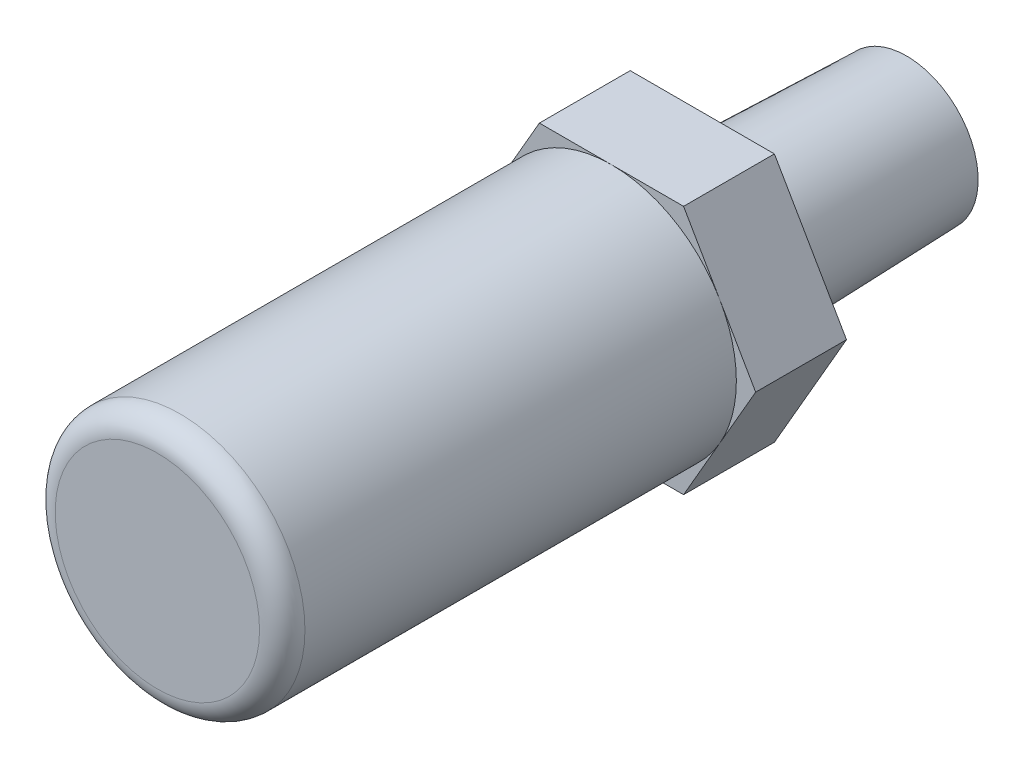
ISO-10303-21;
HEADER;
FILE_DESCRIPTION(('STEP AP214'),'2;1');
FILE_NAME('part.step','',(''),(''),'','','');
FILE_SCHEMA(('AUTOMOTIVE_DESIGN { 1 0 10303 214 1 1 1 1 }'));
ENDSEC;
DATA;
#1=APPLICATION_CONTEXT('core data for automotive mechanical design processes');
#2=APPLICATION_PROTOCOL_DEFINITION('international standard','automotive_design',2000,#1);
#3=PRODUCT_CONTEXT('',#1,'mechanical');
#4=PRODUCT('Part','Part','',(#3));
#5=PRODUCT_RELATED_PRODUCT_CATEGORY('part','',(#4));
#6=PRODUCT_DEFINITION_FORMATION('','',#4);
#7=PRODUCT_DEFINITION_CONTEXT('part definition',#1,'design');
#8=PRODUCT_DEFINITION('design','',#6,#7);
#9=PRODUCT_DEFINITION_SHAPE('','',#8);
#10=(LENGTH_UNIT() NAMED_UNIT(*) SI_UNIT(.MILLI.,.METRE.));
#11=(NAMED_UNIT(*) PLANE_ANGLE_UNIT() SI_UNIT($,.RADIAN.));
#12=(NAMED_UNIT(*) SI_UNIT($,.STERADIAN.) SOLID_ANGLE_UNIT());
#13=UNCERTAINTY_MEASURE_WITH_UNIT(LENGTH_MEASURE(1.E-05),#10,'distance_accuracy_value','');
#14=(GEOMETRIC_REPRESENTATION_CONTEXT(3) GLOBAL_UNCERTAINTY_ASSIGNED_CONTEXT((#13)) GLOBAL_UNIT_ASSIGNED_CONTEXT((#10,
#11,#12)) REPRESENTATION_CONTEXT('',''));
#15=CARTESIAN_POINT('',(0.,0.,0.));
#16=DIRECTION('',(0.,0.,1.));
#17=DIRECTION('',(1.,0.,0.));
#18=AXIS2_PLACEMENT_3D('',#15,#16,#17);
#19=CARTESIAN_POINT('',(0.,0.,-40.));
#20=DIRECTION('',(0.,0.,1.));
#21=DIRECTION('',(1.,0.,0.));
#22=AXIS2_PLACEMENT_3D('',#19,#20,#21);
#23=CYLINDRICAL_SURFACE('',#22,11.);
#24=CARTESIAN_POINT('',(0.,0.,-2.));
#25=DIRECTION('',(0.,0.,1.));
#26=DIRECTION('',(1.,0.,0.));
#27=AXIS2_PLACEMENT_3D('',#24,#25,#26);
#28=CIRCLE('',#27,11.);
#29=CARTESIAN_POINT('',(11.,0.,-2.));
#30=VERTEX_POINT('',#29);
#31=EDGE_CURVE('E11',#30,#30,#28,.F.);
#32=ORIENTED_EDGE('',*,*,#31,.T.);
#33=EDGE_LOOP('',(#32));
#34=FACE_BOUND('',#33,.T.);
#35=CARTESIAN_POINT('',(0.,0.,-40.));
#36=DIRECTION('',(0.,0.,1.));
#37=DIRECTION('',(1.,0.,0.));
#38=AXIS2_PLACEMENT_3D('',#35,#36,#37);
#39=CIRCLE('',#38,11.);
#40=CARTESIAN_POINT('',(9.52627944162882,5.5,-40.));
#41=VERTEX_POINT('',#40);
#42=CARTESIAN_POINT('',(0.,11.,-40.));
#43=VERTEX_POINT('',#42);
#44=EDGE_CURVE('E137',#41,#43,#39,.T.);
#45=ORIENTED_EDGE('',*,*,#44,.T.);
#46=CARTESIAN_POINT('',(-9.52627944162883,5.5,-40.));
#47=VERTEX_POINT('',#46);
#48=EDGE_CURVE('E57',#43,#47,#39,.T.);
#49=ORIENTED_EDGE('',*,*,#48,.T.);
#50=CARTESIAN_POINT('',(-9.52627944162882,-5.5,-40.));
#51=VERTEX_POINT('',#50);
#52=EDGE_CURVE('E267',#47,#51,#39,.T.);
#53=ORIENTED_EDGE('',*,*,#52,.T.);
#54=CARTESIAN_POINT('',(0.,-11.,-40.));
#55=VERTEX_POINT('',#54);
#56=EDGE_CURVE('E268',#51,#55,#39,.T.);
#57=ORIENTED_EDGE('',*,*,#56,.T.);
#58=CARTESIAN_POINT('',(9.52627944162882,-5.49999999999999,-40.));
#59=VERTEX_POINT('',#58);
#60=EDGE_CURVE('E135',#55,#59,#39,.T.);
#61=ORIENTED_EDGE('',*,*,#60,.T.);
#62=EDGE_CURVE('E132',#59,#41,#39,.T.);
#63=ORIENTED_EDGE('',*,*,#62,.T.);
#64=EDGE_LOOP('',(#45,#49,#53,#57,#61,#63));
#65=FACE_BOUND('',#64,.T.);
#66=ADVANCED_FACE('F34',(#34,#65),#23,.T.);
#67=CARTESIAN_POINT('',(0.,0.,0.));
#68=DIRECTION('',(0.,0.,1.));
#69=DIRECTION('',(1.,0.,0.));
#70=AXIS2_PLACEMENT_3D('',#67,#68,#69);
#71=PLANE('',#70);
#72=CARTESIAN_POINT('',(0.,0.,0.));
#73=DIRECTION('',(0.,0.,1.));
#74=DIRECTION('',(1.,0.,0.));
#75=AXIS2_PLACEMENT_3D('',#72,#73,#74);
#76=CIRCLE('',#75,9.);
#77=CARTESIAN_POINT('',(9.,0.,0.));
#78=VERTEX_POINT('',#77);
#79=EDGE_CURVE('E42',#78,#78,#76,.T.);
#80=ORIENTED_EDGE('',*,*,#79,.T.);
#81=EDGE_LOOP('',(#80));
#82=FACE_BOUND('',#81,.T.);
#83=ADVANCED_FACE('F151',(#82),#71,.T.);
#84=CARTESIAN_POINT('',(-6.35085296108588,11.,-40.));
#85=DIRECTION('',(0.,0.,-1.));
#86=DIRECTION('',(-1.,0.,0.));
#87=AXIS2_PLACEMENT_3D('',#84,#85,#86);
#88=PLANE('',#87);
#89=ORIENTED_EDGE('',*,*,#44,.F.);
#90=DIRECTION('',(0.5,-0.866025403784438,0.));
#91=VECTOR('',#90,1.);
#92=CARTESIAN_POINT('',(6.35085296108588,11.,-40.));
#93=LINE('',#92,#91);
#94=CARTESIAN_POINT('',(6.35085296108588,11.,-40.));
#95=VERTEX_POINT('',#94);
#96=EDGE_CURVE('E49',#95,#41,#93,.T.);
#97=ORIENTED_EDGE('',*,*,#96,.F.);
#98=DIRECTION('',(1.,0.,0.));
#99=VECTOR('',#98,1.);
#100=CARTESIAN_POINT('',(-6.35085296108589,11.,-40.));
#101=LINE('',#100,#99);
#102=EDGE_CURVE('E229',#43,#95,#101,.T.);
#103=ORIENTED_EDGE('',*,*,#102,.F.);
#104=EDGE_LOOP('',(#89,#97,#103));
#105=FACE_BOUND('',#104,.T.);
#106=ADVANCED_FACE('F168',(#105),#88,.F.);
#107=ORIENTED_EDGE('',*,*,#48,.F.);
#108=CARTESIAN_POINT('',(-6.35085296108589,11.,-40.));
#109=VERTEX_POINT('',#108);
#110=EDGE_CURVE('E230',#109,#43,#101,.T.);
#111=ORIENTED_EDGE('',*,*,#110,.F.);
#112=DIRECTION('',(0.5,0.866025403784439,0.));
#113=VECTOR('',#112,1.);
#114=CARTESIAN_POINT('',(-12.7017059221718,0.,-40.));
#115=LINE('',#114,#113);
#116=EDGE_CURVE('E131',#47,#109,#115,.T.);
#117=ORIENTED_EDGE('',*,*,#116,.F.);
#118=EDGE_LOOP('',(#107,#111,#117));
#119=FACE_BOUND('',#118,.T.);
#120=ADVANCED_FACE('F276',(#119),#88,.F.);
#121=ORIENTED_EDGE('',*,*,#52,.F.);
#122=CARTESIAN_POINT('',(-12.7017059221718,0.,-40.));
#123=VERTEX_POINT('',#122);
#124=EDGE_CURVE('E227',#123,#47,#115,.T.);
#125=ORIENTED_EDGE('',*,*,#124,.F.);
#126=DIRECTION('',(-0.5,0.866025403784439,0.));
#127=VECTOR('',#126,1.);
#128=CARTESIAN_POINT('',(-6.35085296108588,-11.,-40.));
#129=LINE('',#128,#127);
#130=EDGE_CURVE('E242',#51,#123,#129,.T.);
#131=ORIENTED_EDGE('',*,*,#130,.F.);
#132=EDGE_LOOP('',(#121,#125,#131));
#133=FACE_BOUND('',#132,.T.);
#134=ADVANCED_FACE('F275',(#133),#88,.F.);
#135=ORIENTED_EDGE('',*,*,#56,.F.);
#136=CARTESIAN_POINT('',(-6.35085296108588,-11.,-40.));
#137=VERTEX_POINT('',#136);
#138=EDGE_CURVE('E127',#137,#51,#129,.T.);
#139=ORIENTED_EDGE('',*,*,#138,.F.);
#140=DIRECTION('',(-1.,0.,0.));
#141=VECTOR('',#140,1.);
#142=CARTESIAN_POINT('',(6.35085296108588,-11.,-40.));
#143=LINE('',#142,#141);
#144=EDGE_CURVE('E238',#55,#137,#143,.T.);
#145=ORIENTED_EDGE('',*,*,#144,.F.);
#146=EDGE_LOOP('',(#135,#139,#145));
#147=FACE_BOUND('',#146,.T.);
#148=ADVANCED_FACE('F272',(#147),#88,.F.);
#149=ORIENTED_EDGE('',*,*,#60,.F.);
#150=CARTESIAN_POINT('',(6.35085296108588,-11.,-40.));
#151=VERTEX_POINT('',#150);
#152=EDGE_CURVE('E239',#151,#55,#143,.T.);
#153=ORIENTED_EDGE('',*,*,#152,.F.);
#154=DIRECTION('',(-0.5,-0.866025403784438,0.));
#155=VECTOR('',#154,1.);
#156=CARTESIAN_POINT('',(12.7017059221718,0.,-40.));
#157=LINE('',#156,#155);
#158=EDGE_CURVE('E234',#59,#151,#157,.T.);
#159=ORIENTED_EDGE('',*,*,#158,.F.);
#160=EDGE_LOOP('',(#149,#153,#159));
#161=FACE_BOUND('',#160,.T.);
#162=ADVANCED_FACE('F174',(#161),#88,.F.);
#163=CARTESIAN_POINT('',(-12.7017059221718,0.,-48.));
#164=DIRECTION('',(0.866025403784439,-0.5,0.));
#165=DIRECTION('',(0.5,0.866025403784439,0.));
#166=AXIS2_PLACEMENT_3D('',#163,#164,#165);
#167=PLANE('',#166);
#168=ORIENTED_EDGE('',*,*,#124,.T.);
#169=ORIENTED_EDGE('',*,*,#116,.T.);
#170=DIRECTION('',(0.,0.,1.));
#171=VECTOR('',#170,1.);
#172=CARTESIAN_POINT('',(-6.35085296108589,11.,-48.));
#173=LINE('',#172,#171);
#174=CARTESIAN_POINT('',(-6.35085296108589,11.,-48.));
#175=VERTEX_POINT('',#174);
#176=EDGE_CURVE('E113',#175,#109,#173,.T.);
#177=ORIENTED_EDGE('',*,*,#176,.F.);
#178=DIRECTION('',(0.5,0.866025403784439,0.));
#179=VECTOR('',#178,1.);
#180=CARTESIAN_POINT('',(-12.7017059221718,0.,-48.));
#181=LINE('',#180,#179);
#182=CARTESIAN_POINT('',(-12.7017059221718,0.,-48.));
#183=VERTEX_POINT('',#182);
#184=EDGE_CURVE('E118',#183,#175,#181,.T.);
#185=ORIENTED_EDGE('',*,*,#184,.F.);
#186=DIRECTION('',(0.,0.,1.));
#187=VECTOR('',#186,1.);
#188=CARTESIAN_POINT('',(-12.7017059221718,0.,-48.));
#189=LINE('',#188,#187);
#190=EDGE_CURVE('E226',#183,#123,#189,.T.);
#191=ORIENTED_EDGE('',*,*,#190,.T.);
#192=EDGE_LOOP('',(#168,#169,#177,#185,#191));
#193=FACE_BOUND('',#192,.T.);
#194=ADVANCED_FACE('F130',(#193),#167,.F.);
#195=CARTESIAN_POINT('',(-6.35085296108589,11.,-48.));
#196=DIRECTION('',(0.,-1.,0.));
#197=DIRECTION('',(1.,0.,0.));
#198=AXIS2_PLACEMENT_3D('',#195,#196,#197);
#199=PLANE('',#198);
#200=ORIENTED_EDGE('',*,*,#110,.T.);
#201=ORIENTED_EDGE('',*,*,#102,.T.);
#202=DIRECTION('',(0.,0.,1.));
#203=VECTOR('',#202,1.);
#204=CARTESIAN_POINT('',(6.35085296108588,11.,-48.));
#205=LINE('',#204,#203);
#206=CARTESIAN_POINT('',(6.35085296108588,11.,-48.));
#207=VERTEX_POINT('',#206);
#208=EDGE_CURVE('E114',#207,#95,#205,.T.);
#209=ORIENTED_EDGE('',*,*,#208,.F.);
#210=DIRECTION('',(1.,0.,0.));
#211=VECTOR('',#210,1.);
#212=CARTESIAN_POINT('',(-6.35085296108589,11.,-48.));
#213=LINE('',#212,#211);
#214=EDGE_CURVE('E108',#175,#207,#213,.T.);
#215=ORIENTED_EDGE('',*,*,#214,.F.);
#216=ORIENTED_EDGE('',*,*,#176,.T.);
#217=EDGE_LOOP('',(#200,#201,#209,#215,#216));
#218=FACE_BOUND('',#217,.T.);
#219=ADVANCED_FACE('F111',(#218),#199,.F.);
#220=CARTESIAN_POINT('',(6.35085296108588,11.,-48.));
#221=DIRECTION('',(-0.866025403784439,-0.5,0.));
#222=DIRECTION('',(0.5,-0.866025403784439,0.));
#223=AXIS2_PLACEMENT_3D('',#220,#221,#222);
#224=PLANE('',#223);
#225=ORIENTED_EDGE('',*,*,#96,.T.);
#226=CARTESIAN_POINT('',(12.7017059221718,0.,-40.));
#227=VERTEX_POINT('',#226);
#228=EDGE_CURVE('E232',#41,#227,#93,.T.);
#229=ORIENTED_EDGE('',*,*,#228,.T.);
#230=DIRECTION('',(0.,0.,1.));
#231=VECTOR('',#230,1.);
#232=CARTESIAN_POINT('',(12.7017059221718,0.,-48.));
#233=LINE('',#232,#231);
#234=CARTESIAN_POINT('',(12.7017059221718,0.,-48.));
#235=VERTEX_POINT('',#234);
#236=EDGE_CURVE('E138',#235,#227,#233,.T.);
#237=ORIENTED_EDGE('',*,*,#236,.F.);
#238=DIRECTION('',(0.5,-0.866025403784438,0.));
#239=VECTOR('',#238,1.);
#240=CARTESIAN_POINT('',(6.35085296108588,11.,-48.));
#241=LINE('',#240,#239);
#242=EDGE_CURVE('E117',#207,#235,#241,.T.);
#243=ORIENTED_EDGE('',*,*,#242,.F.);
#244=ORIENTED_EDGE('',*,*,#208,.T.);
#245=EDGE_LOOP('',(#225,#229,#237,#243,#244));
#246=FACE_BOUND('',#245,.T.);
#247=ADVANCED_FACE('F177',(#246),#224,.F.);
#248=CARTESIAN_POINT('',(12.7017059221718,0.,-48.));
#249=DIRECTION('',(-0.866025403784439,0.5,0.));
#250=DIRECTION('',(-0.5,-0.866025403784439,0.));
#251=AXIS2_PLACEMENT_3D('',#248,#249,#250);
#252=PLANE('',#251);
#253=EDGE_CURVE('E235',#227,#59,#157,.T.);
#254=ORIENTED_EDGE('',*,*,#253,.T.);
#255=ORIENTED_EDGE('',*,*,#158,.T.);
#256=DIRECTION('',(0.,0.,1.));
#257=VECTOR('',#256,1.);
#258=CARTESIAN_POINT('',(6.35085296108588,-11.,-48.));
#259=LINE('',#258,#257);
#260=CARTESIAN_POINT('',(6.35085296108588,-11.,-48.));
#261=VERTEX_POINT('',#260);
#262=EDGE_CURVE('E249',#261,#151,#259,.T.);
#263=ORIENTED_EDGE('',*,*,#262,.F.);
#264=DIRECTION('',(-0.5,-0.866025403784438,0.));
#265=VECTOR('',#264,1.);
#266=CARTESIAN_POINT('',(12.7017059221718,0.,-48.));
#267=LINE('',#266,#265);
#268=EDGE_CURVE('E221',#235,#261,#267,.T.);
#269=ORIENTED_EDGE('',*,*,#268,.F.);
#270=ORIENTED_EDGE('',*,*,#236,.T.);
#271=EDGE_LOOP('',(#254,#255,#263,#269,#270));
#272=FACE_BOUND('',#271,.T.);
#273=ADVANCED_FACE('F180',(#272),#252,.F.);
#274=CARTESIAN_POINT('',(6.35085296108588,-11.,-48.));
#275=DIRECTION('',(0.,1.,0.));
#276=DIRECTION('',(0.,0.,1.));
#277=AXIS2_PLACEMENT_3D('',#274,#275,#276);
#278=PLANE('',#277);
#279=ORIENTED_EDGE('',*,*,#152,.T.);
#280=ORIENTED_EDGE('',*,*,#144,.T.);
#281=DIRECTION('',(0.,0.,1.));
#282=VECTOR('',#281,1.);
#283=CARTESIAN_POINT('',(-6.35085296108588,-11.,-48.));
#284=LINE('',#283,#282);
#285=CARTESIAN_POINT('',(-6.35085296108588,-11.,-48.));
#286=VERTEX_POINT('',#285);
#287=EDGE_CURVE('E246',#286,#137,#284,.T.);
#288=ORIENTED_EDGE('',*,*,#287,.F.);
#289=DIRECTION('',(-1.,0.,0.));
#290=VECTOR('',#289,1.);
#291=CARTESIAN_POINT('',(6.35085296108588,-11.,-48.));
#292=LINE('',#291,#290);
#293=EDGE_CURVE('E223',#261,#286,#292,.T.);
#294=ORIENTED_EDGE('',*,*,#293,.F.);
#295=ORIENTED_EDGE('',*,*,#262,.T.);
#296=EDGE_LOOP('',(#279,#280,#288,#294,#295));
#297=FACE_BOUND('',#296,.T.);
#298=ADVANCED_FACE('F183',(#297),#278,.F.);
#299=CARTESIAN_POINT('',(-6.35085296108588,-11.,-48.));
#300=DIRECTION('',(0.866025403784439,0.5,0.));
#301=DIRECTION('',(-0.5,0.866025403784439,0.));
#302=AXIS2_PLACEMENT_3D('',#299,#300,#301);
#303=PLANE('',#302);
#304=ORIENTED_EDGE('',*,*,#138,.T.);
#305=ORIENTED_EDGE('',*,*,#130,.T.);
#306=ORIENTED_EDGE('',*,*,#190,.F.);
#307=DIRECTION('',(-0.5,0.866025403784439,0.));
#308=VECTOR('',#307,1.);
#309=CARTESIAN_POINT('',(-6.35085296108588,-11.,-48.));
#310=LINE('',#309,#308);
#311=EDGE_CURVE('E123',#286,#183,#310,.T.);
#312=ORIENTED_EDGE('',*,*,#311,.F.);
#313=ORIENTED_EDGE('',*,*,#287,.T.);
#314=EDGE_LOOP('',(#304,#305,#306,#312,#313));
#315=FACE_BOUND('',#314,.T.);
#316=ADVANCED_FACE('F187',(#315),#303,.F.);
#317=CARTESIAN_POINT('',(-6.35085296108588,11.,-48.));
#318=DIRECTION('',(0.,0.,-1.));
#319=DIRECTION('',(-1.,0.,0.));
#320=AXIS2_PLACEMENT_3D('',#317,#318,#319);
#321=PLANE('',#320);
#322=CARTESIAN_POINT('',(0.,0.,-48.));
#323=DIRECTION('',(0.,0.,-1.));
#324=DIRECTION('',(-1.,0.,0.));
#325=AXIS2_PLACEMENT_3D('',#322,#323,#324);
#326=CIRCLE('',#325,6.86000000000001);
#327=CARTESIAN_POINT('',(-6.86000000000001,0.,-48.));
#328=VERTEX_POINT('',#327);
#329=EDGE_CURVE('E143',#328,#328,#326,.T.);
#330=ORIENTED_EDGE('',*,*,#329,.F.);
#331=EDGE_LOOP('',(#330));
#332=FACE_BOUND('',#331,.T.);
#333=ORIENTED_EDGE('',*,*,#184,.T.);
#334=ORIENTED_EDGE('',*,*,#214,.T.);
#335=ORIENTED_EDGE('',*,*,#242,.T.);
#336=ORIENTED_EDGE('',*,*,#268,.T.);
#337=ORIENTED_EDGE('',*,*,#293,.T.);
#338=ORIENTED_EDGE('',*,*,#311,.T.);
#339=EDGE_LOOP('',(#333,#334,#335,#336,#337,#338));
#340=FACE_BOUND('',#339,.T.);
#341=ADVANCED_FACE('F121',(#332,#340),#321,.T.);
#342=ORIENTED_EDGE('',*,*,#62,.F.);
#343=ORIENTED_EDGE('',*,*,#253,.F.);
#344=ORIENTED_EDGE('',*,*,#228,.F.);
#345=EDGE_LOOP('',(#342,#343,#344));
#346=FACE_BOUND('',#345,.T.);
#347=ADVANCED_FACE('F192',(#346),#88,.F.);
#348=CARTESIAN_POINT('',(0.,0.,0.));
#349=DIRECTION('',(0.,0.,-1.));
#350=DIRECTION('',(-1.,0.,0.));
#351=AXIS2_PLACEMENT_3D('',#348,#349,#350);
#352=CYLINDRICAL_SURFACE('',#351,2.00000000000001);
#353=CARTESIAN_POINT('',(0.,0.,-66.));
#354=DIRECTION('',(0.,0.,-1.));
#355=DIRECTION('',(-1.,0.,0.));
#356=AXIS2_PLACEMENT_3D('',#353,#354,#355);
#357=CIRCLE('',#356,2.00000000000001);
#358=CARTESIAN_POINT('',(-2.00000000000001,0.,-66.));
#359=VERTEX_POINT('',#358);
#360=EDGE_CURVE('E215',#359,#359,#357,.T.);
#361=ORIENTED_EDGE('',*,*,#360,.T.);
#362=EDGE_LOOP('',(#361));
#363=FACE_BOUND('',#362,.T.);
#364=CARTESIAN_POINT('',(0.,0.,-48.));
#365=DIRECTION('',(0.,0.,-1.));
#366=DIRECTION('',(-1.,0.,0.));
#367=AXIS2_PLACEMENT_3D('',#364,#365,#366);
#368=CIRCLE('',#367,2.00000000000001);
#369=CARTESIAN_POINT('',(-2.00000000000001,0.,-48.));
#370=VERTEX_POINT('',#369);
#371=EDGE_CURVE('E146',#370,#370,#368,.F.);
#372=ORIENTED_EDGE('',*,*,#371,.T.);
#373=EDGE_LOOP('',(#372));
#374=FACE_BOUND('',#373,.T.);
#375=ADVANCED_FACE('F194',(#363,#374),#352,.F.);
#376=CARTESIAN_POINT('',(0.,6.29750333593348,-66.));
#377=DIRECTION('',(0.,0.,-1.));
#378=DIRECTION('',(-1.,0.,0.));
#379=AXIS2_PLACEMENT_3D('',#376,#377,#378);
#380=PLANE('',#379);
#381=CARTESIAN_POINT('',(0.,0.,-66.));
#382=DIRECTION('',(0.,0.,-1.));
#383=DIRECTION('',(-1.,0.,0.));
#384=AXIS2_PLACEMENT_3D('',#381,#382,#383);
#385=CIRCLE('',#384,6.29750333593348);
#386=CARTESIAN_POINT('',(-6.29750333593348,0.,-66.));
#387=VERTEX_POINT('',#386);
#388=EDGE_CURVE('E214',#387,#387,#385,.T.);
#389=ORIENTED_EDGE('',*,*,#388,.T.);
#390=EDGE_LOOP('',(#389));
#391=FACE_BOUND('',#390,.T.);
#392=ORIENTED_EDGE('',*,*,#360,.F.);
#393=EDGE_LOOP('',(#392));
#394=FACE_BOUND('',#393,.T.);
#395=ADVANCED_FACE('F201',(#391,#394),#380,.T.);
#396=CARTESIAN_POINT('',(0.,0.,-66.));
#397=DIRECTION('',(0.,0.,1.));
#398=DIRECTION('',(1.,0.,0.));
#399=AXIS2_PLACEMENT_3D('',#396,#397,#398);
#400=CONICAL_SURFACE('',#399,6.29750333593348,0.0312396482814391);
#401=ORIENTED_EDGE('',*,*,#329,.T.);
#402=EDGE_LOOP('',(#401));
#403=FACE_BOUND('',#402,.T.);
#404=ORIENTED_EDGE('',*,*,#388,.F.);
#405=EDGE_LOOP('',(#404));
#406=FACE_BOUND('',#405,.T.);
#407=ADVANCED_FACE('F159',(#403,#406),#400,.T.);
#408=ORIENTED_EDGE('',*,*,#371,.F.);
#409=EDGE_LOOP('',(#408));
#410=FACE_BOUND('',#409,.T.);
#411=ADVANCED_FACE('F154',(#410),#321,.T.);
#412=CARTESIAN_POINT('',(0.,0.,-2.));
#413=DIRECTION('',(0.,0.,1.));
#414=DIRECTION('',(1.,0.,0.));
#415=AXIS2_PLACEMENT_3D('',#412,#413,#414);
#416=TOROIDAL_SURFACE('',#415,9.,2.);
#417=ORIENTED_EDGE('',*,*,#31,.F.);
#418=EDGE_LOOP('',(#417));
#419=FACE_BOUND('',#418,.T.);
#420=ORIENTED_EDGE('',*,*,#79,.F.);
#421=EDGE_LOOP('',(#420));
#422=FACE_BOUND('',#421,.T.);
#423=ADVANCED_FACE('F36',(#419,#422),#416,.T.);
#424=CLOSED_SHELL('',(#66,#83,#106,#120,#134,#148,#162,#194,#219,#247,#273,#298,#316,#341,#347,
#375,#395,#407,#411,#423));
#425=MANIFOLD_SOLID_BREP('B2',#424);
#426=ADVANCED_BREP_SHAPE_REPRESENTATION('',(#18,#425),#14);
#427=SHAPE_DEFINITION_REPRESENTATION(#9,#426);
ENDSEC;
END-ISO-10303-21;
